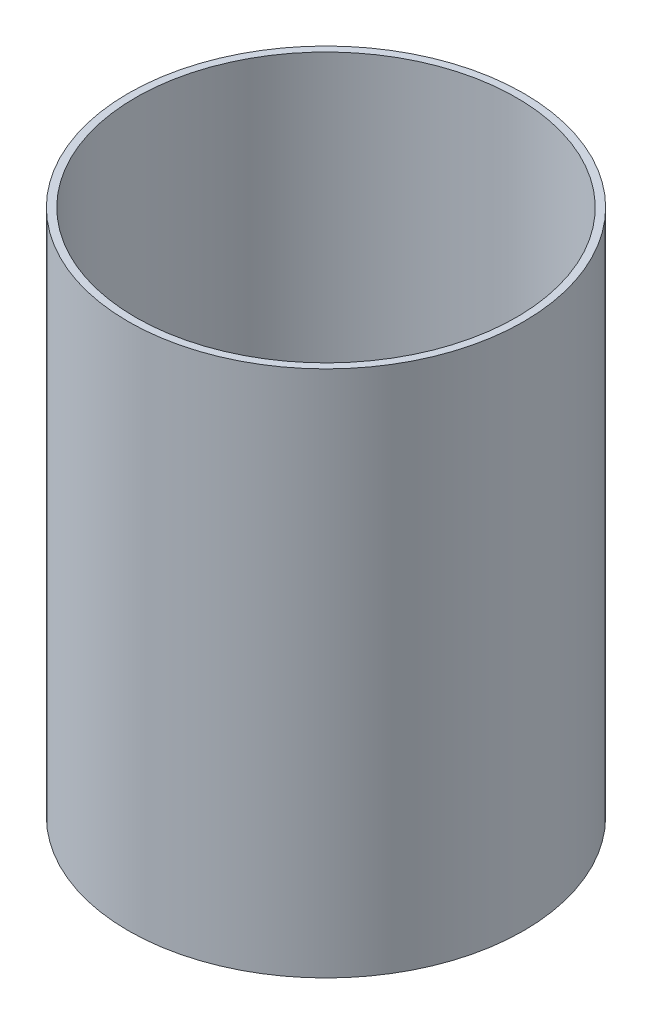
ISO-10303-21;
HEADER;
FILE_DESCRIPTION(('STEP AP214'),'2;1');
FILE_NAME('part.step','',(''),(''),'','','');
FILE_SCHEMA(('AUTOMOTIVE_DESIGN { 1 0 10303 214 1 1 1 1 }'));
ENDSEC;
DATA;
#1=APPLICATION_CONTEXT('core data for automotive mechanical design processes');
#2=APPLICATION_PROTOCOL_DEFINITION('international standard','automotive_design',2000,#1);
#3=PRODUCT_CONTEXT('',#1,'mechanical');
#4=PRODUCT('Part','Part','',(#3));
#5=PRODUCT_RELATED_PRODUCT_CATEGORY('part','',(#4));
#6=PRODUCT_DEFINITION_FORMATION('','',#4);
#7=PRODUCT_DEFINITION_CONTEXT('part definition',#1,'design');
#8=PRODUCT_DEFINITION('design','',#6,#7);
#9=PRODUCT_DEFINITION_SHAPE('','',#8);
#10=(LENGTH_UNIT() NAMED_UNIT(*) SI_UNIT(.MILLI.,.METRE.));
#11=(NAMED_UNIT(*) PLANE_ANGLE_UNIT() SI_UNIT($,.RADIAN.));
#12=(NAMED_UNIT(*) SI_UNIT($,.STERADIAN.) SOLID_ANGLE_UNIT());
#13=UNCERTAINTY_MEASURE_WITH_UNIT(LENGTH_MEASURE(1.E-05),#10,'distance_accuracy_value','');
#14=(GEOMETRIC_REPRESENTATION_CONTEXT(3) GLOBAL_UNCERTAINTY_ASSIGNED_CONTEXT((#13)) GLOBAL_UNIT_ASSIGNED_CONTEXT((#10,
#11,#12)) REPRESENTATION_CONTEXT('',''));
#15=CARTESIAN_POINT('',(0.,0.,0.));
#16=DIRECTION('',(0.,0.,1.));
#17=DIRECTION('',(1.,0.,0.));
#18=AXIS2_PLACEMENT_3D('',#15,#16,#17);
#19=CARTESIAN_POINT('',(0.,203.2,0.));
#20=DIRECTION('',(0.,1.,0.));
#21=DIRECTION('',(0.,0.,1.));
#22=AXIS2_PLACEMENT_3D('',#19,#20,#21);
#23=PLANE('',#22);
#24=CARTESIAN_POINT('',(0.,203.2,0.));
#25=DIRECTION('',(0.,1.,0.));
#26=DIRECTION('',(0.,0.,1.));
#27=AXIS2_PLACEMENT_3D('',#24,#25,#26);
#28=CIRCLE('',#27,76.1746);
#29=CARTESIAN_POINT('',(0.,203.2,76.1746));
#30=VERTEX_POINT('',#29);
#31=EDGE_CURVE('E10',#30,#30,#28,.T.);
#32=ORIENTED_EDGE('',*,*,#31,.T.);
#33=EDGE_LOOP('',(#32));
#34=FACE_BOUND('',#33,.T.);
#35=CARTESIAN_POINT('',(0.,203.2,0.));
#36=DIRECTION('',(0.,1.,0.));
#37=DIRECTION('',(0.,0.,1.));
#38=AXIS2_PLACEMENT_3D('',#35,#36,#37);
#39=CIRCLE('',#38,73.3425);
#40=CARTESIAN_POINT('',(0.,203.2,73.3425));
#41=VERTEX_POINT('',#40);
#42=EDGE_CURVE('E50',#41,#41,#39,.T.);
#43=ORIENTED_EDGE('',*,*,#42,.F.);
#44=EDGE_LOOP('',(#43));
#45=FACE_BOUND('',#44,.T.);
#46=ADVANCED_FACE('F39',(#34,#45),#23,.T.);
#47=CARTESIAN_POINT('',(0.,0.,0.));
#48=DIRECTION('',(0.,1.,0.));
#49=DIRECTION('',(0.,0.,1.));
#50=AXIS2_PLACEMENT_3D('',#47,#48,#49);
#51=PLANE('',#50);
#52=CARTESIAN_POINT('',(0.,0.,0.));
#53=DIRECTION('',(0.,1.,0.));
#54=DIRECTION('',(0.,0.,1.));
#55=AXIS2_PLACEMENT_3D('',#52,#53,#54);
#56=CIRCLE('',#55,76.1746);
#57=CARTESIAN_POINT('',(0.,0.,76.1746));
#58=VERTEX_POINT('',#57);
#59=EDGE_CURVE('E43',#58,#58,#56,.T.);
#60=ORIENTED_EDGE('',*,*,#59,.F.);
#61=EDGE_LOOP('',(#60));
#62=FACE_BOUND('',#61,.T.);
#63=CARTESIAN_POINT('',(0.,0.,0.));
#64=DIRECTION('',(0.,1.,0.));
#65=DIRECTION('',(0.,0.,1.));
#66=AXIS2_PLACEMENT_3D('',#63,#64,#65);
#67=CIRCLE('',#66,73.3425);
#68=CARTESIAN_POINT('',(0.,0.,73.3425));
#69=VERTEX_POINT('',#68);
#70=EDGE_CURVE('E52',#69,#69,#67,.T.);
#71=ORIENTED_EDGE('',*,*,#70,.T.);
#72=EDGE_LOOP('',(#71));
#73=FACE_BOUND('',#72,.T.);
#74=ADVANCED_FACE('F62',(#62,#73),#51,.F.);
#75=CARTESIAN_POINT('',(0.,203.2,0.));
#76=DIRECTION('',(0.,-1.,0.));
#77=DIRECTION('',(0.,0.,-1.));
#78=AXIS2_PLACEMENT_3D('',#75,#76,#77);
#79=CYLINDRICAL_SURFACE('',#78,76.1746);
#80=ORIENTED_EDGE('',*,*,#31,.F.);
#81=EDGE_LOOP('',(#80));
#82=FACE_BOUND('',#81,.T.);
#83=ORIENTED_EDGE('',*,*,#59,.T.);
#84=EDGE_LOOP('',(#83));
#85=FACE_BOUND('',#84,.T.);
#86=ADVANCED_FACE('F41',(#82,#85),#79,.T.);
#87=CARTESIAN_POINT('',(0.,203.2,0.));
#88=DIRECTION('',(0.,-1.,0.));
#89=DIRECTION('',(0.,0.,-1.));
#90=AXIS2_PLACEMENT_3D('',#87,#88,#89);
#91=CYLINDRICAL_SURFACE('',#90,73.3425);
#92=ORIENTED_EDGE('',*,*,#42,.T.);
#93=EDGE_LOOP('',(#92));
#94=FACE_BOUND('',#93,.T.);
#95=ORIENTED_EDGE('',*,*,#70,.F.);
#96=EDGE_LOOP('',(#95));
#97=FACE_BOUND('',#96,.T.);
#98=ADVANCED_FACE('F58',(#94,#97),#91,.F.);
#99=CLOSED_SHELL('',(#46,#74,#86,#98));
#100=MANIFOLD_SOLID_BREP('B2',#99);
#101=ADVANCED_BREP_SHAPE_REPRESENTATION('',(#18,#100),#14);
#102=SHAPE_DEFINITION_REPRESENTATION(#9,#101);
ENDSEC;
END-ISO-10303-21;
